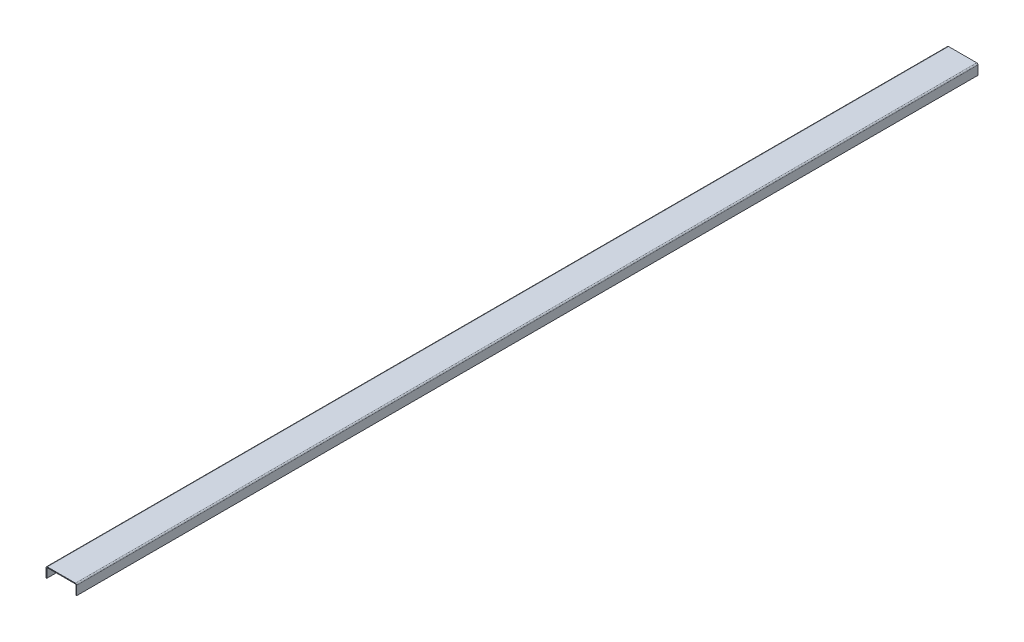
ISO-10303-21;
HEADER;
FILE_DESCRIPTION(('STEP AP214'),'2;1');
FILE_NAME('part.step','',(''),(''),'','','');
FILE_SCHEMA(('AUTOMOTIVE_DESIGN { 1 0 10303 214 1 1 1 1 }'));
ENDSEC;
DATA;
#1=APPLICATION_CONTEXT('core data for automotive mechanical design processes');
#2=APPLICATION_PROTOCOL_DEFINITION('international standard','automotive_design',2000,#1);
#3=PRODUCT_CONTEXT('',#1,'mechanical');
#4=PRODUCT('Part','Part','',(#3));
#5=PRODUCT_RELATED_PRODUCT_CATEGORY('part','',(#4));
#6=PRODUCT_DEFINITION_FORMATION('','',#4);
#7=PRODUCT_DEFINITION_CONTEXT('part definition',#1,'design');
#8=PRODUCT_DEFINITION('design','',#6,#7);
#9=PRODUCT_DEFINITION_SHAPE('','',#8);
#10=(LENGTH_UNIT() NAMED_UNIT(*) SI_UNIT(.MILLI.,.METRE.));
#11=(NAMED_UNIT(*) PLANE_ANGLE_UNIT() SI_UNIT($,.RADIAN.));
#12=(NAMED_UNIT(*) SI_UNIT($,.STERADIAN.) SOLID_ANGLE_UNIT());
#13=UNCERTAINTY_MEASURE_WITH_UNIT(LENGTH_MEASURE(1.E-05),#10,'distance_accuracy_value','');
#14=(GEOMETRIC_REPRESENTATION_CONTEXT(3) GLOBAL_UNCERTAINTY_ASSIGNED_CONTEXT((#13)) GLOBAL_UNIT_ASSIGNED_CONTEXT((#10,
#11,#12)) REPRESENTATION_CONTEXT('',''));
#15=CARTESIAN_POINT('',(0.,0.,0.));
#16=DIRECTION('',(0.,0.,1.));
#17=DIRECTION('',(1.,0.,0.));
#18=AXIS2_PLACEMENT_3D('',#15,#16,#17);
#19=CARTESIAN_POINT('',(-3491.67400138118,-4.85722573273506E-12,1780.));
#20=DIRECTION('',(0.,1.,0.));
#21=DIRECTION('',(-1.,0.,0.));
#22=AXIS2_PLACEMENT_3D('',#19,#20,#21);
#23=PLANE('',#22);
#24=DIRECTION('',(1.,0.,0.));
#25=VECTOR('',#24,1.);
#26=CARTESIAN_POINT('',(-3491.67400138118,-4.86416462663897E-12,20.));
#27=LINE('',#26,#25);
#28=CARTESIAN_POINT('',(28.5,0.,20.));
#29=VERTEX_POINT('',#28);
#30=CARTESIAN_POINT('',(30.,0.,20.));
#31=VERTEX_POINT('',#30);
#32=EDGE_CURVE('E226',#29,#31,#27,.T.);
#33=ORIENTED_EDGE('',*,*,#32,.T.);
#34=DIRECTION('',(0.,0.,1.));
#35=VECTOR('',#34,1.);
#36=CARTESIAN_POINT('',(30.,0.,1780.));
#37=LINE('',#36,#35);
#38=CARTESIAN_POINT('',(30.,0.,1780.));
#39=VERTEX_POINT('',#38);
#40=EDGE_CURVE('E78',#31,#39,#37,.T.);
#41=ORIENTED_EDGE('',*,*,#40,.T.);
#42=DIRECTION('',(1.,0.,0.));
#43=VECTOR('',#42,1.);
#44=CARTESIAN_POINT('',(-3491.67400138118,-4.85722573273506E-12,1780.));
#45=LINE('',#44,#43);
#46=CARTESIAN_POINT('',(28.5,0.,1780.));
#47=VERTEX_POINT('',#46);
#48=EDGE_CURVE('E220',#47,#39,#45,.T.);
#49=ORIENTED_EDGE('',*,*,#48,.F.);
#50=DIRECTION('',(0.,0.,1.));
#51=VECTOR('',#50,1.);
#52=CARTESIAN_POINT('',(28.5,0.,1780.));
#53=LINE('',#52,#51);
#54=EDGE_CURVE('E12',#29,#47,#53,.T.);
#55=ORIENTED_EDGE('',*,*,#54,.F.);
#56=EDGE_LOOP('',(#33,#41,#49,#55));
#57=FACE_BOUND('',#56,.T.);
#58=ADVANCED_FACE('F53',(#57),#23,.F.);
#59=CARTESIAN_POINT('',(-3491.67400138118,-4.86416462663897E-12,20.));
#60=DIRECTION('',(0.,0.,1.));
#61=DIRECTION('',(0.,-1.,0.));
#62=AXIS2_PLACEMENT_3D('',#59,#60,#61);
#63=PLANE('',#62);
#64=DIRECTION('',(1.,0.,0.));
#65=VECTOR('',#64,1.);
#66=CARTESIAN_POINT('',(-3491.67400138118,17.4999999999951,20.));
#67=LINE('',#66,#65);
#68=CARTESIAN_POINT('',(28.4999999999999,17.5,20.));
#69=VERTEX_POINT('',#68);
#70=CARTESIAN_POINT('',(30.,17.5,20.));
#71=VERTEX_POINT('',#70);
#72=EDGE_CURVE('E206',#69,#71,#67,.T.);
#73=ORIENTED_EDGE('',*,*,#72,.T.);
#74=DIRECTION('',(0.,1.,0.));
#75=VECTOR('',#74,1.);
#76=CARTESIAN_POINT('',(30.,17.5,20.));
#77=LINE('',#76,#75);
#78=EDGE_CURVE('E208',#31,#71,#77,.T.);
#79=ORIENTED_EDGE('',*,*,#78,.F.);
#80=ORIENTED_EDGE('',*,*,#32,.F.);
#81=DIRECTION('',(0.,-1.,0.));
#82=VECTOR('',#81,1.);
#83=CARTESIAN_POINT('',(28.5,0.,20.));
#84=LINE('',#83,#82);
#85=EDGE_CURVE('E65',#69,#29,#84,.T.);
#86=ORIENTED_EDGE('',*,*,#85,.F.);
#87=EDGE_LOOP('',(#73,#79,#80,#86));
#88=FACE_BOUND('',#87,.T.);
#89=ADVANCED_FACE('F207',(#88),#63,.F.);
#90=CARTESIAN_POINT('',(30.,0.,1780.));
#91=DIRECTION('',(-1.,0.,0.));
#92=DIRECTION('',(0.,-1.,0.));
#93=AXIS2_PLACEMENT_3D('',#90,#91,#92);
#94=PLANE('',#93);
#95=DIRECTION('',(0.,0.,-1.));
#96=VECTOR('',#95,1.);
#97=CARTESIAN_POINT('',(30.,17.5,1780.));
#98=LINE('',#97,#96);
#99=CARTESIAN_POINT('',(30.,17.5,1780.));
#100=VERTEX_POINT('',#99);
#101=EDGE_CURVE('E218',#100,#71,#98,.T.);
#102=ORIENTED_EDGE('',*,*,#101,.F.);
#103=DIRECTION('',(0.,1.,0.));
#104=VECTOR('',#103,1.);
#105=CARTESIAN_POINT('',(30.,18.5,1780.));
#106=LINE('',#105,#104);
#107=EDGE_CURVE('E268',#39,#100,#106,.T.);
#108=ORIENTED_EDGE('',*,*,#107,.F.);
#109=ORIENTED_EDGE('',*,*,#40,.F.);
#110=ORIENTED_EDGE('',*,*,#78,.T.);
#111=EDGE_LOOP('',(#102,#108,#109,#110));
#112=FACE_BOUND('',#111,.T.);
#113=ADVANCED_FACE('F217',(#112),#94,.F.);
#114=CARTESIAN_POINT('',(-3491.67400138118,-4.85722573273506E-12,1780.));
#115=DIRECTION('',(0.,0.,-1.));
#116=DIRECTION('',(0.,1.,0.));
#117=AXIS2_PLACEMENT_3D('',#114,#115,#116);
#118=PLANE('',#117);
#119=ORIENTED_EDGE('',*,*,#48,.T.);
#120=ORIENTED_EDGE('',*,*,#107,.T.);
#121=DIRECTION('',(1.,0.,0.));
#122=VECTOR('',#121,1.);
#123=CARTESIAN_POINT('',(-3491.67400138118,17.4999999999952,1780.));
#124=LINE('',#123,#122);
#125=CARTESIAN_POINT('',(28.5,17.5,1780.));
#126=VERTEX_POINT('',#125);
#127=EDGE_CURVE('E58',#126,#100,#124,.T.);
#128=ORIENTED_EDGE('',*,*,#127,.F.);
#129=DIRECTION('',(0.,-1.,0.));
#130=VECTOR('',#129,1.);
#131=CARTESIAN_POINT('',(28.5,0.,1780.));
#132=LINE('',#131,#130);
#133=EDGE_CURVE('E272',#47,#126,#132,.F.);
#134=ORIENTED_EDGE('',*,*,#133,.F.);
#135=EDGE_LOOP('',(#119,#120,#128,#134));
#136=FACE_BOUND('',#135,.T.);
#137=ADVANCED_FACE('F443',(#136),#118,.F.);
#138=CARTESIAN_POINT('',(28.5,0.,1780.));
#139=DIRECTION('',(-1.,0.,0.));
#140=DIRECTION('',(0.,-1.,0.));
#141=AXIS2_PLACEMENT_3D('',#138,#139,#140);
#142=PLANE('',#141);
#143=ORIENTED_EDGE('',*,*,#133,.T.);
#144=DIRECTION('',(0.,0.,-1.));
#145=VECTOR('',#144,1.);
#146=CARTESIAN_POINT('',(28.5,17.5,1780.));
#147=LINE('',#146,#145);
#148=EDGE_CURVE('E275',#126,#69,#147,.T.);
#149=ORIENTED_EDGE('',*,*,#148,.T.);
#150=ORIENTED_EDGE('',*,*,#85,.T.);
#151=ORIENTED_EDGE('',*,*,#54,.T.);
#152=EDGE_LOOP('',(#143,#149,#150,#151));
#153=FACE_BOUND('',#152,.T.);
#154=ADVANCED_FACE('F56',(#153),#142,.T.);
#155=CARTESIAN_POINT('',(3491.67400138118,-4.86416462663897E-12,1780.));
#156=DIRECTION('',(0.,1.,0.));
#157=DIRECTION('',(-1.,0.,0.));
#158=AXIS2_PLACEMENT_3D('',#155,#156,#157);
#159=PLANE('',#158);
#160=DIRECTION('',(-1.,0.,0.));
#161=VECTOR('',#160,1.);
#162=CARTESIAN_POINT('',(3491.67400138118,-4.85722573273506E-12,1780.));
#163=LINE('',#162,#161);
#164=CARTESIAN_POINT('',(-28.5,0.,1780.));
#165=VERTEX_POINT('',#164);
#166=CARTESIAN_POINT('',(-30.,0.,1780.));
#167=VERTEX_POINT('',#166);
#168=EDGE_CURVE('E303',#165,#167,#163,.T.);
#169=ORIENTED_EDGE('',*,*,#168,.T.);
#170=DIRECTION('',(0.,0.,1.));
#171=VECTOR('',#170,1.);
#172=CARTESIAN_POINT('',(-30.,0.,1780.));
#173=LINE('',#172,#171);
#174=CARTESIAN_POINT('',(-30.,0.,20.));
#175=VERTEX_POINT('',#174);
#176=EDGE_CURVE('E299',#167,#175,#173,.F.);
#177=ORIENTED_EDGE('',*,*,#176,.T.);
#178=DIRECTION('',(-1.,0.,0.));
#179=VECTOR('',#178,1.);
#180=CARTESIAN_POINT('',(3491.67400138118,-4.85722573273506E-12,20.));
#181=LINE('',#180,#179);
#182=CARTESIAN_POINT('',(-28.5,0.,20.));
#183=VERTEX_POINT('',#182);
#184=EDGE_CURVE('E288',#183,#175,#181,.T.);
#185=ORIENTED_EDGE('',*,*,#184,.F.);
#186=DIRECTION('',(0.,0.,1.));
#187=VECTOR('',#186,1.);
#188=CARTESIAN_POINT('',(-28.5,0.,1780.));
#189=LINE('',#188,#187);
#190=EDGE_CURVE('E331',#165,#183,#189,.F.);
#191=ORIENTED_EDGE('',*,*,#190,.F.);
#192=EDGE_LOOP('',(#169,#177,#185,#191));
#193=FACE_BOUND('',#192,.T.);
#194=ADVANCED_FACE('F420',(#193),#159,.F.);
#195=CARTESIAN_POINT('',(3491.67400138118,19.9999999999951,1780.));
#196=DIRECTION('',(0.,0.,-1.));
#197=DIRECTION('',(0.,-1.,0.));
#198=AXIS2_PLACEMENT_3D('',#195,#196,#197);
#199=PLANE('',#198);
#200=DIRECTION('',(-1.,0.,0.));
#201=VECTOR('',#200,1.);
#202=CARTESIAN_POINT('',(3491.67400138118,17.4999999999952,1780.));
#203=LINE('',#202,#201);
#204=CARTESIAN_POINT('',(-28.5,17.5,1780.));
#205=VERTEX_POINT('',#204);
#206=CARTESIAN_POINT('',(-30.,17.5,1780.));
#207=VERTEX_POINT('',#206);
#208=EDGE_CURVE('E296',#205,#207,#203,.T.);
#209=ORIENTED_EDGE('',*,*,#208,.T.);
#210=DIRECTION('',(0.,1.,0.));
#211=VECTOR('',#210,1.);
#212=CARTESIAN_POINT('',(-30.,17.5,1780.));
#213=LINE('',#212,#211);
#214=EDGE_CURVE('E292',#207,#167,#213,.F.);
#215=ORIENTED_EDGE('',*,*,#214,.T.);
#216=ORIENTED_EDGE('',*,*,#168,.F.);
#217=DIRECTION('',(0.,1.,0.));
#218=VECTOR('',#217,1.);
#219=CARTESIAN_POINT('',(-28.5,20.,1780.));
#220=LINE('',#219,#218);
#221=EDGE_CURVE('E155',#205,#165,#220,.F.);
#222=ORIENTED_EDGE('',*,*,#221,.F.);
#223=EDGE_LOOP('',(#209,#215,#216,#222));
#224=FACE_BOUND('',#223,.T.);
#225=ADVANCED_FACE('F421',(#224),#199,.F.);
#226=CARTESIAN_POINT('',(-30.,20.,1780.));
#227=DIRECTION('',(1.,0.,0.));
#228=DIRECTION('',(0.,1.,0.));
#229=AXIS2_PLACEMENT_3D('',#226,#227,#228);
#230=PLANE('',#229);
#231=ORIENTED_EDGE('',*,*,#176,.F.);
#232=ORIENTED_EDGE('',*,*,#214,.F.);
#233=DIRECTION('',(0.,0.,-1.));
#234=VECTOR('',#233,1.);
#235=CARTESIAN_POINT('',(-30.,17.5,1780.));
#236=LINE('',#235,#234);
#237=CARTESIAN_POINT('',(-30.,17.5,20.));
#238=VERTEX_POINT('',#237);
#239=EDGE_CURVE('E307',#238,#207,#236,.F.);
#240=ORIENTED_EDGE('',*,*,#239,.F.);
#241=DIRECTION('',(0.,1.,0.));
#242=VECTOR('',#241,1.);
#243=CARTESIAN_POINT('',(-30.,18.5,20.));
#244=LINE('',#243,#242);
#245=EDGE_CURVE('E283',#175,#238,#244,.T.);
#246=ORIENTED_EDGE('',*,*,#245,.F.);
#247=EDGE_LOOP('',(#231,#232,#240,#246));
#248=FACE_BOUND('',#247,.T.);
#249=ADVANCED_FACE('F417',(#248),#230,.F.);
#250=CARTESIAN_POINT('',(3491.67400138118,19.9999999999951,20.));
#251=DIRECTION('',(0.,0.,1.));
#252=DIRECTION('',(0.,1.,0.));
#253=AXIS2_PLACEMENT_3D('',#250,#251,#252);
#254=PLANE('',#253);
#255=ORIENTED_EDGE('',*,*,#184,.T.);
#256=ORIENTED_EDGE('',*,*,#245,.T.);
#257=DIRECTION('',(-1.,0.,0.));
#258=VECTOR('',#257,1.);
#259=CARTESIAN_POINT('',(3491.67400138118,17.4999999999952,20.));
#260=LINE('',#259,#258);
#261=CARTESIAN_POINT('',(-28.5,17.5,20.));
#262=VERTEX_POINT('',#261);
#263=EDGE_CURVE('E148',#262,#238,#260,.T.);
#264=ORIENTED_EDGE('',*,*,#263,.F.);
#265=DIRECTION('',(0.,1.,0.));
#266=VECTOR('',#265,1.);
#267=CARTESIAN_POINT('',(-28.5,20.,20.));
#268=LINE('',#267,#266);
#269=EDGE_CURVE('E122',#183,#262,#268,.T.);
#270=ORIENTED_EDGE('',*,*,#269,.F.);
#271=EDGE_LOOP('',(#255,#256,#264,#270));
#272=FACE_BOUND('',#271,.T.);
#273=ADVANCED_FACE('F418',(#272),#254,.F.);
#274=CARTESIAN_POINT('',(-28.5,20.,1780.));
#275=DIRECTION('',(1.,0.,0.));
#276=DIRECTION('',(0.,1.,0.));
#277=AXIS2_PLACEMENT_3D('',#274,#275,#276);
#278=PLANE('',#277);
#279=ORIENTED_EDGE('',*,*,#221,.T.);
#280=ORIENTED_EDGE('',*,*,#190,.T.);
#281=ORIENTED_EDGE('',*,*,#269,.T.);
#282=DIRECTION('',(0.,0.,-1.));
#283=VECTOR('',#282,1.);
#284=CARTESIAN_POINT('',(-28.5,17.5,1780.));
#285=LINE('',#284,#283);
#286=EDGE_CURVE('E327',#262,#205,#285,.F.);
#287=ORIENTED_EDGE('',*,*,#286,.T.);
#288=EDGE_LOOP('',(#279,#280,#281,#287));
#289=FACE_BOUND('',#288,.T.);
#290=ADVANCED_FACE('F337',(#289),#278,.T.);
#291=CARTESIAN_POINT('',(30.,20.,1780.));
#292=DIRECTION('',(0.,-1.,0.));
#293=DIRECTION('',(0.,0.,-1.));
#294=AXIS2_PLACEMENT_3D('',#291,#292,#293);
#295=PLANE('',#294);
#296=DIRECTION('',(0.,0.,-1.));
#297=VECTOR('',#296,1.);
#298=CARTESIAN_POINT('',(-27.5,20.,1780.));
#299=LINE('',#298,#297);
#300=CARTESIAN_POINT('',(-27.5,20.,1780.));
#301=VERTEX_POINT('',#300);
#302=CARTESIAN_POINT('',(-27.5,20.,20.));
#303=VERTEX_POINT('',#302);
#304=EDGE_CURVE('E167',#301,#303,#299,.T.);
#305=ORIENTED_EDGE('',*,*,#304,.F.);
#306=DIRECTION('',(1.,0.,0.));
#307=VECTOR('',#306,1.);
#308=CARTESIAN_POINT('',(-28.5,20.,1780.));
#309=LINE('',#308,#307);
#310=CARTESIAN_POINT('',(27.5,20.,1780.));
#311=VERTEX_POINT('',#310);
#312=EDGE_CURVE('E361',#311,#301,#309,.F.);
#313=ORIENTED_EDGE('',*,*,#312,.F.);
#314=DIRECTION('',(0.,0.,-1.));
#315=VECTOR('',#314,1.);
#316=CARTESIAN_POINT('',(27.5,20.,1780.));
#317=LINE('',#316,#315);
#318=CARTESIAN_POINT('',(27.5,20.,20.));
#319=VERTEX_POINT('',#318);
#320=EDGE_CURVE('E179',#319,#311,#317,.F.);
#321=ORIENTED_EDGE('',*,*,#320,.F.);
#322=DIRECTION('',(-1.,0.,0.));
#323=VECTOR('',#322,1.);
#324=CARTESIAN_POINT('',(28.5,20.,20.));
#325=LINE('',#324,#323);
#326=EDGE_CURVE('E367',#303,#319,#325,.F.);
#327=ORIENTED_EDGE('',*,*,#326,.F.);
#328=EDGE_LOOP('',(#305,#313,#321,#327));
#329=FACE_BOUND('',#328,.T.);
#330=ADVANCED_FACE('F412',(#329),#295,.F.);
#331=CARTESIAN_POINT('',(30.,-3503.21833058807,1780.));
#332=DIRECTION('',(0.,0.,-1.));
#333=DIRECTION('',(-1.,0.,0.));
#334=AXIS2_PLACEMENT_3D('',#331,#332,#333);
#335=PLANE('',#334);
#336=DIRECTION('',(0.,1.,0.));
#337=VECTOR('',#336,1.);
#338=CARTESIAN_POINT('',(27.5,-3503.21833058807,1780.));
#339=LINE('',#338,#337);
#340=CARTESIAN_POINT('',(27.5,18.5,1780.));
#341=VERTEX_POINT('',#340);
#342=EDGE_CURVE('E386',#341,#311,#339,.T.);
#343=ORIENTED_EDGE('',*,*,#342,.T.);
#344=ORIENTED_EDGE('',*,*,#312,.T.);
#345=DIRECTION('',(0.,1.,0.));
#346=VECTOR('',#345,1.);
#347=CARTESIAN_POINT('',(-27.5,-3503.21833058807,1780.));
#348=LINE('',#347,#346);
#349=CARTESIAN_POINT('',(-27.5,18.5,1780.));
#350=VERTEX_POINT('',#349);
#351=EDGE_CURVE('E312',#350,#301,#348,.T.);
#352=ORIENTED_EDGE('',*,*,#351,.F.);
#353=DIRECTION('',(1.,0.,0.));
#354=VECTOR('',#353,1.);
#355=CARTESIAN_POINT('',(30.,18.5,1780.));
#356=LINE('',#355,#354);
#357=EDGE_CURVE('E371',#341,#350,#356,.F.);
#358=ORIENTED_EDGE('',*,*,#357,.F.);
#359=EDGE_LOOP('',(#343,#344,#352,#358));
#360=FACE_BOUND('',#359,.T.);
#361=ADVANCED_FACE('F409',(#360),#335,.F.);
#362=CARTESIAN_POINT('',(30.,-3503.21833058807,20.));
#363=DIRECTION('',(0.,0.,1.));
#364=DIRECTION('',(1.,0.,0.));
#365=AXIS2_PLACEMENT_3D('',#362,#363,#364);
#366=PLANE('',#365);
#367=DIRECTION('',(0.,1.,0.));
#368=VECTOR('',#367,1.);
#369=CARTESIAN_POINT('',(-27.5,-3503.21833058807,20.));
#370=LINE('',#369,#368);
#371=CARTESIAN_POINT('',(-27.5,18.5,20.));
#372=VERTEX_POINT('',#371);
#373=EDGE_CURVE('E317',#372,#303,#370,.T.);
#374=ORIENTED_EDGE('',*,*,#373,.T.);
#375=ORIENTED_EDGE('',*,*,#326,.T.);
#376=DIRECTION('',(0.,1.,0.));
#377=VECTOR('',#376,1.);
#378=CARTESIAN_POINT('',(27.5,-3503.21833058807,20.));
#379=LINE('',#378,#377);
#380=CARTESIAN_POINT('',(27.5,18.5,20.));
#381=VERTEX_POINT('',#380);
#382=EDGE_CURVE('E229',#381,#319,#379,.T.);
#383=ORIENTED_EDGE('',*,*,#382,.F.);
#384=DIRECTION('',(1.,0.,0.));
#385=VECTOR('',#384,1.);
#386=CARTESIAN_POINT('',(30.,18.5,20.));
#387=LINE('',#386,#385);
#388=EDGE_CURVE('E377',#372,#381,#387,.T.);
#389=ORIENTED_EDGE('',*,*,#388,.F.);
#390=EDGE_LOOP('',(#374,#375,#383,#389));
#391=FACE_BOUND('',#390,.T.);
#392=ADVANCED_FACE('F405',(#391),#366,.F.);
#393=CARTESIAN_POINT('',(30.,18.5,1780.));
#394=DIRECTION('',(0.,-1.,0.));
#395=DIRECTION('',(0.,0.,-1.));
#396=AXIS2_PLACEMENT_3D('',#393,#394,#395);
#397=PLANE('',#396);
#398=ORIENTED_EDGE('',*,*,#357,.T.);
#399=DIRECTION('',(0.,0.,-1.));
#400=VECTOR('',#399,1.);
#401=CARTESIAN_POINT('',(-27.5,18.5,1780.));
#402=LINE('',#401,#400);
#403=EDGE_CURVE('E349',#350,#372,#402,.T.);
#404=ORIENTED_EDGE('',*,*,#403,.T.);
#405=ORIENTED_EDGE('',*,*,#388,.T.);
#406=DIRECTION('',(0.,0.,-1.));
#407=VECTOR('',#406,1.);
#408=CARTESIAN_POINT('',(27.5,18.5,1780.));
#409=LINE('',#408,#407);
#410=EDGE_CURVE('E382',#381,#341,#409,.F.);
#411=ORIENTED_EDGE('',*,*,#410,.T.);
#412=EDGE_LOOP('',(#398,#404,#405,#411));
#413=FACE_BOUND('',#412,.T.);
#414=ADVANCED_FACE('F407',(#413),#397,.T.);
#415=CARTESIAN_POINT('',(-27.5,17.5,20.));
#416=DIRECTION('',(0.,0.,-1.));
#417=DIRECTION('',(-1.,0.,0.));
#418=AXIS2_PLACEMENT_3D('',#415,#416,#417);
#419=PLANE('',#418);
#420=ORIENTED_EDGE('',*,*,#373,.F.);
#421=CARTESIAN_POINT('',(-27.5,17.5,20.));
#422=DIRECTION('',(0.,0.,-1.));
#423=DIRECTION('',(-1.,0.,0.));
#424=AXIS2_PLACEMENT_3D('',#421,#422,#423);
#425=CIRCLE('',#424,1.);
#426=EDGE_CURVE('E351',#372,#262,#425,.F.);
#427=ORIENTED_EDGE('',*,*,#426,.T.);
#428=ORIENTED_EDGE('',*,*,#263,.T.);
#429=CARTESIAN_POINT('',(-27.5,17.5,20.));
#430=DIRECTION('',(0.,0.,-1.));
#431=DIRECTION('',(-1.,0.,0.));
#432=AXIS2_PLACEMENT_3D('',#429,#430,#431);
#433=CIRCLE('',#432,2.5);
#434=EDGE_CURVE('E356',#303,#238,#433,.F.);
#435=ORIENTED_EDGE('',*,*,#434,.F.);
#436=EDGE_LOOP('',(#420,#427,#428,#435));
#437=FACE_BOUND('',#436,.T.);
#438=ADVANCED_FACE('F413',(#437),#419,.T.);
#439=CARTESIAN_POINT('',(-27.5,17.5,1780.));
#440=DIRECTION('',(0.,0.,1.));
#441=DIRECTION('',(1.,0.,0.));
#442=AXIS2_PLACEMENT_3D('',#439,#440,#441);
#443=PLANE('',#442);
#444=ORIENTED_EDGE('',*,*,#208,.F.);
#445=CARTESIAN_POINT('',(-27.5,17.5,1780.));
#446=DIRECTION('',(0.,0.,-1.));
#447=DIRECTION('',(-1.,0.,0.));
#448=AXIS2_PLACEMENT_3D('',#445,#446,#447);
#449=CIRCLE('',#448,1.);
#450=EDGE_CURVE('E235',#205,#350,#449,.T.);
#451=ORIENTED_EDGE('',*,*,#450,.T.);
#452=ORIENTED_EDGE('',*,*,#351,.T.);
#453=CARTESIAN_POINT('',(-27.5,17.5,1780.));
#454=DIRECTION('',(0.,0.,-1.));
#455=DIRECTION('',(-1.,0.,0.));
#456=AXIS2_PLACEMENT_3D('',#453,#454,#455);
#457=CIRCLE('',#456,2.5);
#458=EDGE_CURVE('E345',#207,#301,#457,.T.);
#459=ORIENTED_EDGE('',*,*,#458,.F.);
#460=EDGE_LOOP('',(#444,#451,#452,#459));
#461=FACE_BOUND('',#460,.T.);
#462=ADVANCED_FACE('F343',(#461),#443,.T.);
#463=CARTESIAN_POINT('',(-27.5,17.5,3542.54117966078));
#464=DIRECTION('',(0.,0.,-1.));
#465=DIRECTION('',(-1.,0.,0.));
#466=AXIS2_PLACEMENT_3D('',#463,#464,#465);
#467=CYLINDRICAL_SURFACE('',#466,2.5);
#468=ORIENTED_EDGE('',*,*,#458,.T.);
#469=ORIENTED_EDGE('',*,*,#304,.T.);
#470=ORIENTED_EDGE('',*,*,#434,.T.);
#471=ORIENTED_EDGE('',*,*,#239,.T.);
#472=EDGE_LOOP('',(#468,#469,#470,#471));
#473=FACE_BOUND('',#472,.T.);
#474=ADVANCED_FACE('F414',(#473),#467,.T.);
#475=CARTESIAN_POINT('',(-27.5,17.5,3542.54117966078));
#476=DIRECTION('',(0.,0.,-1.));
#477=DIRECTION('',(-1.,0.,0.));
#478=AXIS2_PLACEMENT_3D('',#475,#476,#477);
#479=CYLINDRICAL_SURFACE('',#478,1.);
#480=ORIENTED_EDGE('',*,*,#450,.F.);
#481=ORIENTED_EDGE('',*,*,#286,.F.);
#482=ORIENTED_EDGE('',*,*,#426,.F.);
#483=ORIENTED_EDGE('',*,*,#403,.F.);
#484=EDGE_LOOP('',(#480,#481,#482,#483));
#485=FACE_BOUND('',#484,.T.);
#486=ADVANCED_FACE('F347',(#485),#479,.F.);
#487=CARTESIAN_POINT('',(27.5,17.5,1780.));
#488=DIRECTION('',(0.,0.,1.));
#489=DIRECTION('',(0.,-1.,0.));
#490=AXIS2_PLACEMENT_3D('',#487,#488,#489);
#491=PLANE('',#490);
#492=ORIENTED_EDGE('',*,*,#342,.F.);
#493=CARTESIAN_POINT('',(27.5,17.5,1780.));
#494=DIRECTION('',(0.,0.,1.));
#495=DIRECTION('',(0.,-1.,0.));
#496=AXIS2_PLACEMENT_3D('',#493,#494,#495);
#497=CIRCLE('',#496,1.);
#498=EDGE_CURVE('E231',#341,#126,#497,.F.);
#499=ORIENTED_EDGE('',*,*,#498,.T.);
#500=ORIENTED_EDGE('',*,*,#127,.T.);
#501=CARTESIAN_POINT('',(27.5,17.5,1780.));
#502=DIRECTION('',(0.,0.,1.));
#503=DIRECTION('',(0.,-1.,0.));
#504=AXIS2_PLACEMENT_3D('',#501,#502,#503);
#505=CIRCLE('',#504,2.5);
#506=EDGE_CURVE('E224',#311,#100,#505,.F.);
#507=ORIENTED_EDGE('',*,*,#506,.F.);
#508=EDGE_LOOP('',(#492,#499,#500,#507));
#509=FACE_BOUND('',#508,.T.);
#510=ADVANCED_FACE('F454',(#509),#491,.T.);
#511=CARTESIAN_POINT('',(27.5,17.5,20.));
#512=DIRECTION('',(0.,0.,-1.));
#513=DIRECTION('',(0.,1.,0.));
#514=AXIS2_PLACEMENT_3D('',#511,#512,#513);
#515=PLANE('',#514);
#516=ORIENTED_EDGE('',*,*,#72,.F.);
#517=CARTESIAN_POINT('',(27.5,17.5,20.));
#518=DIRECTION('',(0.,0.,1.));
#519=DIRECTION('',(0.,-1.,0.));
#520=AXIS2_PLACEMENT_3D('',#517,#518,#519);
#521=CIRCLE('',#520,1.);
#522=EDGE_CURVE('E238',#69,#381,#521,.T.);
#523=ORIENTED_EDGE('',*,*,#522,.T.);
#524=ORIENTED_EDGE('',*,*,#382,.T.);
#525=CARTESIAN_POINT('',(27.5,17.5,20.));
#526=DIRECTION('',(0.,0.,1.));
#527=DIRECTION('',(0.,-1.,0.));
#528=AXIS2_PLACEMENT_3D('',#525,#526,#527);
#529=CIRCLE('',#528,2.5);
#530=EDGE_CURVE('E223',#71,#319,#529,.T.);
#531=ORIENTED_EDGE('',*,*,#530,.F.);
#532=EDGE_LOOP('',(#516,#523,#524,#531));
#533=FACE_BOUND('',#532,.T.);
#534=ADVANCED_FACE('F227',(#533),#515,.T.);
#535=CARTESIAN_POINT('',(27.5,17.5,-1741.81023098403));
#536=DIRECTION('',(0.,0.,1.));
#537=DIRECTION('',(0.,-1.,0.));
#538=AXIS2_PLACEMENT_3D('',#535,#536,#537);
#539=CYLINDRICAL_SURFACE('',#538,2.5);
#540=ORIENTED_EDGE('',*,*,#530,.T.);
#541=ORIENTED_EDGE('',*,*,#320,.T.);
#542=ORIENTED_EDGE('',*,*,#506,.T.);
#543=ORIENTED_EDGE('',*,*,#101,.T.);
#544=EDGE_LOOP('',(#540,#541,#542,#543));
#545=FACE_BOUND('',#544,.T.);
#546=ADVANCED_FACE('F222',(#545),#539,.T.);
#547=CARTESIAN_POINT('',(27.5,17.5,-1741.81023098403));
#548=DIRECTION('',(0.,0.,1.));
#549=DIRECTION('',(0.,-1.,0.));
#550=AXIS2_PLACEMENT_3D('',#547,#548,#549);
#551=CYLINDRICAL_SURFACE('',#550,1.);
#552=ORIENTED_EDGE('',*,*,#522,.F.);
#553=ORIENTED_EDGE('',*,*,#148,.F.);
#554=ORIENTED_EDGE('',*,*,#498,.F.);
#555=ORIENTED_EDGE('',*,*,#410,.F.);
#556=EDGE_LOOP('',(#552,#553,#554,#555));
#557=FACE_BOUND('',#556,.T.);
#558=ADVANCED_FACE('F400',(#557),#551,.F.);
#559=CLOSED_SHELL('',(#58,#89,#113,#137,#154,#194,#225,#249,#273,#290,#330,#361,#392,#414,#438,
#462,#474,#486,#510,#534,#546,#558));
#560=MANIFOLD_SOLID_BREP('B2',#559);
#561=ADVANCED_BREP_SHAPE_REPRESENTATION('',(#18,#560),#14);
#562=SHAPE_DEFINITION_REPRESENTATION(#9,#561);
ENDSEC;
END-ISO-10303-21;
